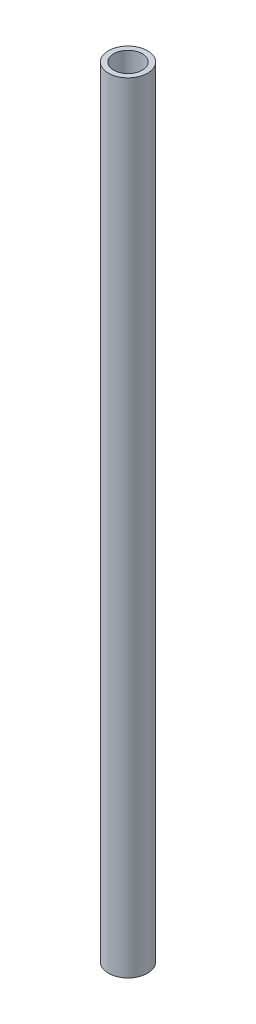
ISO-10303-21;
HEADER;
FILE_DESCRIPTION(('STEP AP214'),'2;1');
FILE_NAME('part.step','',(''),(''),'','','');
FILE_SCHEMA(('AUTOMOTIVE_DESIGN { 1 0 10303 214 1 1 1 1 }'));
ENDSEC;
DATA;
#1=APPLICATION_CONTEXT('core data for automotive mechanical design processes');
#2=APPLICATION_PROTOCOL_DEFINITION('international standard','automotive_design',2000,#1);
#3=PRODUCT_CONTEXT('',#1,'mechanical');
#4=PRODUCT('Part','Part','',(#3));
#5=PRODUCT_RELATED_PRODUCT_CATEGORY('part','',(#4));
#6=PRODUCT_DEFINITION_FORMATION('','',#4);
#7=PRODUCT_DEFINITION_CONTEXT('part definition',#1,'design');
#8=PRODUCT_DEFINITION('design','',#6,#7);
#9=PRODUCT_DEFINITION_SHAPE('','',#8);
#10=(LENGTH_UNIT() NAMED_UNIT(*) SI_UNIT(.MILLI.,.METRE.));
#11=(NAMED_UNIT(*) PLANE_ANGLE_UNIT() SI_UNIT($,.RADIAN.));
#12=(NAMED_UNIT(*) SI_UNIT($,.STERADIAN.) SOLID_ANGLE_UNIT());
#13=UNCERTAINTY_MEASURE_WITH_UNIT(LENGTH_MEASURE(1.E-05),#10,'distance_accuracy_value','');
#14=(GEOMETRIC_REPRESENTATION_CONTEXT(3) GLOBAL_UNCERTAINTY_ASSIGNED_CONTEXT((#13)) GLOBAL_UNIT_ASSIGNED_CONTEXT((#10,
#11,#12)) REPRESENTATION_CONTEXT('',''));
#15=CARTESIAN_POINT('',(0.,0.,0.));
#16=DIRECTION('',(0.,0.,1.));
#17=DIRECTION('',(1.,0.,0.));
#18=AXIS2_PLACEMENT_3D('',#15,#16,#17);
#19=CARTESIAN_POINT('',(0.,18.,0.));
#20=DIRECTION('',(0.,-1.,0.));
#21=DIRECTION('',(0.,0.,-1.));
#22=AXIS2_PLACEMENT_3D('',#19,#20,#21);
#23=CYLINDRICAL_SURFACE('',#22,0.3302);
#24=CARTESIAN_POINT('',(0.,18.,0.));
#25=DIRECTION('',(0.,1.,0.));
#26=DIRECTION('',(0.,0.,1.));
#27=AXIS2_PLACEMENT_3D('',#24,#25,#26);
#28=CIRCLE('',#27,0.3302);
#29=CARTESIAN_POINT('',(0.,18.,0.3302));
#30=VERTEX_POINT('',#29);
#31=EDGE_CURVE('E40',#30,#30,#28,.T.);
#32=ORIENTED_EDGE('',*,*,#31,.T.);
#33=EDGE_LOOP('',(#32));
#34=FACE_BOUND('',#33,.T.);
#35=CARTESIAN_POINT('',(0.,0.,0.));
#36=DIRECTION('',(0.,1.,0.));
#37=DIRECTION('',(0.,0.,1.));
#38=AXIS2_PLACEMENT_3D('',#35,#36,#37);
#39=CIRCLE('',#38,0.3302);
#40=CARTESIAN_POINT('',(0.,0.,0.3302));
#41=VERTEX_POINT('',#40);
#42=EDGE_CURVE('E46',#41,#41,#39,.T.);
#43=ORIENTED_EDGE('',*,*,#42,.F.);
#44=EDGE_LOOP('',(#43));
#45=FACE_BOUND('',#44,.T.);
#46=ADVANCED_FACE('F33',(#34,#45),#23,.F.);
#47=CARTESIAN_POINT('',(0.,18.,0.));
#48=DIRECTION('',(0.,-1.,0.));
#49=DIRECTION('',(0.,0.,-1.));
#50=AXIS2_PLACEMENT_3D('',#47,#48,#49);
#51=CYLINDRICAL_SURFACE('',#50,0.45085);
#52=CARTESIAN_POINT('',(0.,18.,0.));
#53=DIRECTION('',(0.,1.,0.));
#54=DIRECTION('',(0.,0.,1.));
#55=AXIS2_PLACEMENT_3D('',#52,#53,#54);
#56=CIRCLE('',#55,0.45085);
#57=CARTESIAN_POINT('',(0.,18.,0.45085));
#58=VERTEX_POINT('',#57);
#59=EDGE_CURVE('E10',#58,#58,#56,.T.);
#60=ORIENTED_EDGE('',*,*,#59,.F.);
#61=EDGE_LOOP('',(#60));
#62=FACE_BOUND('',#61,.T.);
#63=CARTESIAN_POINT('',(0.,0.,0.));
#64=DIRECTION('',(0.,1.,0.));
#65=DIRECTION('',(0.,0.,1.));
#66=AXIS2_PLACEMENT_3D('',#63,#64,#65);
#67=CIRCLE('',#66,0.45085);
#68=CARTESIAN_POINT('',(0.,0.,0.45085));
#69=VERTEX_POINT('',#68);
#70=EDGE_CURVE('E36',#69,#69,#67,.T.);
#71=ORIENTED_EDGE('',*,*,#70,.T.);
#72=EDGE_LOOP('',(#71));
#73=FACE_BOUND('',#72,.T.);
#74=ADVANCED_FACE('F53',(#62,#73),#51,.T.);
#75=CARTESIAN_POINT('',(0.,18.,0.));
#76=DIRECTION('',(0.,1.,0.));
#77=DIRECTION('',(0.,0.,1.));
#78=AXIS2_PLACEMENT_3D('',#75,#76,#77);
#79=PLANE('',#78);
#80=ORIENTED_EDGE('',*,*,#31,.F.);
#81=EDGE_LOOP('',(#80));
#82=FACE_BOUND('',#81,.T.);
#83=ORIENTED_EDGE('',*,*,#59,.T.);
#84=EDGE_LOOP('',(#83));
#85=FACE_BOUND('',#84,.T.);
#86=ADVANCED_FACE('F57',(#82,#85),#79,.T.);
#87=CARTESIAN_POINT('',(0.,0.,0.));
#88=DIRECTION('',(0.,1.,0.));
#89=DIRECTION('',(0.,0.,1.));
#90=AXIS2_PLACEMENT_3D('',#87,#88,#89);
#91=PLANE('',#90);
#92=ORIENTED_EDGE('',*,*,#42,.T.);
#93=EDGE_LOOP('',(#92));
#94=FACE_BOUND('',#93,.T.);
#95=ORIENTED_EDGE('',*,*,#70,.F.);
#96=EDGE_LOOP('',(#95));
#97=FACE_BOUND('',#96,.T.);
#98=ADVANCED_FACE('F55',(#94,#97),#91,.F.);
#99=CLOSED_SHELL('',(#46,#74,#86,#98));
#100=MANIFOLD_SOLID_BREP('B2',#99);
#101=ADVANCED_BREP_SHAPE_REPRESENTATION('',(#18,#100),#14);
#102=SHAPE_DEFINITION_REPRESENTATION(#9,#101);
ENDSEC;
END-ISO-10303-21;
